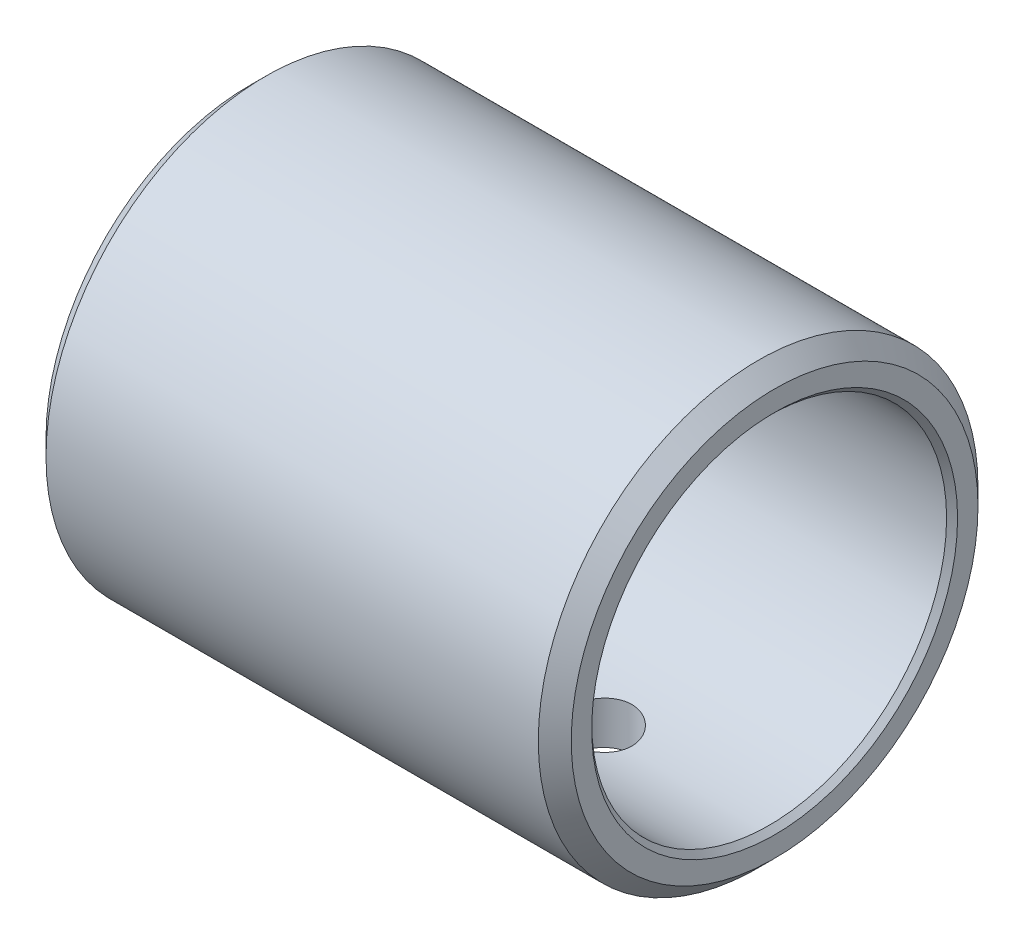
ISO-10303-21;
HEADER;
FILE_DESCRIPTION(('STEP AP214'),'2;1');
FILE_NAME('part.step','',(''),(''),'','','');
FILE_SCHEMA(('AUTOMOTIVE_DESIGN { 1 0 10303 214 1 1 1 1 }'));
ENDSEC;
DATA;
#1=APPLICATION_CONTEXT('core data for automotive mechanical design processes');
#2=APPLICATION_PROTOCOL_DEFINITION('international standard','automotive_design',2000,#1);
#3=PRODUCT_CONTEXT('',#1,'mechanical');
#4=PRODUCT('Part','Part','',(#3));
#5=PRODUCT_RELATED_PRODUCT_CATEGORY('part','',(#4));
#6=PRODUCT_DEFINITION_FORMATION('','',#4);
#7=PRODUCT_DEFINITION_CONTEXT('part definition',#1,'design');
#8=PRODUCT_DEFINITION('design','',#6,#7);
#9=PRODUCT_DEFINITION_SHAPE('','',#8);
#10=(LENGTH_UNIT() NAMED_UNIT(*) SI_UNIT(.MILLI.,.METRE.));
#11=(NAMED_UNIT(*) PLANE_ANGLE_UNIT() SI_UNIT($,.RADIAN.));
#12=(NAMED_UNIT(*) SI_UNIT($,.STERADIAN.) SOLID_ANGLE_UNIT());
#13=UNCERTAINTY_MEASURE_WITH_UNIT(LENGTH_MEASURE(1.E-05),#10,'distance_accuracy_value','');
#14=(GEOMETRIC_REPRESENTATION_CONTEXT(3) GLOBAL_UNCERTAINTY_ASSIGNED_CONTEXT((#13)) GLOBAL_UNIT_ASSIGNED_CONTEXT((#10,
#11,#12)) REPRESENTATION_CONTEXT('',''));
#15=CARTESIAN_POINT('',(0.,0.,0.));
#16=DIRECTION('',(0.,0.,1.));
#17=DIRECTION('',(1.,0.,0.));
#18=AXIS2_PLACEMENT_3D('',#15,#16,#17);
#19=CARTESIAN_POINT('',(0.,0.,0.));
#20=DIRECTION('',(1.,0.,0.));
#21=DIRECTION('',(0.,0.,-1.));
#22=AXIS2_PLACEMENT_3D('',#19,#20,#21);
#23=CYLINDRICAL_SURFACE('',#22,16.15);
#24=CARTESIAN_POINT('',(-32.,-15.8689161570663,3.));
#25=CARTESIAN_POINT('',(-31.833055911466,-15.8689193729994,2.999993567314));
#26=CARTESIAN_POINT('',(-31.6660280287675,-15.8715791864345,2.98601756403366));
#27=CARTESIAN_POINT('',(-31.3366800005733,-15.8819181195118,2.93051932753722));
#28=CARTESIAN_POINT('',(-31.1743640031104,-15.8896015295356,2.888973548015));
#29=CARTESIAN_POINT('',(-30.8592528693755,-15.9090881071179,2.77965392521639));
#30=CARTESIAN_POINT('',(-30.7064490953678,-15.9208874708563,2.71190429235496));
#31=CARTESIAN_POINT('',(-30.4143868407297,-15.947271963233,2.55216393403344));
#32=CARTESIAN_POINT('',(-30.2751272636239,-15.9618568660831,2.46017517310069));
#33=CARTESIAN_POINT('',(-30.0123941606419,-15.992368121215,2.25336978727812));
#34=CARTESIAN_POINT('',(-29.8891101340513,-16.0083074105874,2.13831428834086));
#35=CARTESIAN_POINT('',(-29.6634783242765,-16.0396171623269,1.88915769533491));
#36=CARTESIAN_POINT('',(-29.5611319034402,-16.0549875876264,1.75505536290637));
#37=CARTESIAN_POINT('',(-29.3795556703729,-16.0835662281653,1.47036852943682));
#38=CARTESIAN_POINT('',(-29.3005043288949,-16.0967574263777,1.31966834341584));
#39=CARTESIAN_POINT('',(-29.168911825009,-16.1193465852659,1.00684026870927));
#40=CARTESIAN_POINT('',(-29.1163685233966,-16.1287448520198,0.844713303371084));
#41=CARTESIAN_POINT('',(-29.0398690408333,-16.1425978451571,0.515597086479356));
#42=CARTESIAN_POINT('',(-29.0155934922404,-16.1471077588197,0.348684429713024));
#43=CARTESIAN_POINT('',(-28.9953236835823,-16.1508660642563,0.0130985520982486));
#44=CARTESIAN_POINT('',(-28.9993270579361,-16.1501148961291,-0.155574520309737));
#45=CARTESIAN_POINT('',(-29.0352561584595,-16.1434788505418,-0.487703606743755));
#46=CARTESIAN_POINT('',(-29.0668380205196,-16.1376571970611,-0.65119826492536));
#47=CARTESIAN_POINT('',(-29.1564839635609,-16.1216051767725,-0.970526465303907));
#48=CARTESIAN_POINT('',(-29.2145489964197,-16.1113746514984,-1.12635973190644));
#49=CARTESIAN_POINT('',(-29.3558418996491,-16.0875485465892,-1.42694123908433));
#50=CARTESIAN_POINT('',(-29.4392075995516,-16.0739346107582,-1.57162317635299));
#51=CARTESIAN_POINT('',(-29.6286338856602,-16.0448478634781,-1.84507294507443));
#52=CARTESIAN_POINT('',(-29.7346967387482,-16.0293748664228,-1.97383918491625));
#53=CARTESIAN_POINT('',(-29.9684025705504,-15.9980095645836,-2.21383924438647));
#54=CARTESIAN_POINT('',(-30.0963463617426,-15.9821144540301,-2.32477997107465));
#55=CARTESIAN_POINT('',(-30.3691791490902,-15.9519192707101,-2.52367236811839));
#56=CARTESIAN_POINT('',(-30.5140683841777,-15.9376192204395,-2.61162371426514));
#57=CARTESIAN_POINT('',(-30.8170634992078,-15.9122293988577,-2.76212200352159));
#58=CARTESIAN_POINT('',(-30.9751906900966,-15.9011449373441,-2.82462699575142));
#59=CARTESIAN_POINT('',(-31.2999543502868,-15.8835231384605,-2.92210036596655));
#60=CARTESIAN_POINT('',(-31.4665898724321,-15.8769852961358,-2.95707180192902));
#61=CARTESIAN_POINT('',(-31.8009988747331,-15.8692966897446,-2.99805875968717));
#62=CARTESIAN_POINT('',(-31.968719032866,-15.8680676457401,-3.004495078707));
#63=CARTESIAN_POINT('',(-32.3028377426992,-15.8709264020366,-2.98935651420699));
#64=CARTESIAN_POINT('',(-32.4692363580905,-15.8750139445235,-2.96778298895167));
#65=CARTESIAN_POINT('',(-32.7946092521575,-15.887972445088,-2.89759815956096));
#66=CARTESIAN_POINT('',(-32.9536326834774,-15.8968044580662,-2.84920688861947));
#67=CARTESIAN_POINT('',(-33.2613142312501,-15.9182232783009,-2.7269934454509));
#68=CARTESIAN_POINT('',(-33.4099715951547,-15.9308103578156,-2.65316942918248));
#69=CARTESIAN_POINT('',(-33.6945566470157,-15.9584996441987,-2.48121543361636));
#70=CARTESIAN_POINT('',(-33.8303208464398,-15.9736287563672,-2.38281929379153));
#71=CARTESIAN_POINT('',(-34.083563303703,-16.0046214951236,-2.16487362241044));
#72=CARTESIAN_POINT('',(-34.2010399474514,-16.0204851863864,-2.04532222564283));
#73=CARTESIAN_POINT('',(-34.4159415290735,-16.0514108487518,-1.78658157285044));
#74=CARTESIAN_POINT('',(-34.5130836696507,-16.0664595970687,-1.64715560578479));
#75=CARTESIAN_POINT('',(-34.6825641956172,-16.0938382366002,-1.3537181437136));
#76=CARTESIAN_POINT('',(-34.7549035234813,-16.1061682311176,-1.19970720320209));
#77=CARTESIAN_POINT('',(-34.8723001567152,-16.1266631892054,-0.882258104884032));
#78=CARTESIAN_POINT('',(-34.9174971379771,-16.1348494418412,-0.718873035562327));
#79=CARTESIAN_POINT('',(-34.9797722400186,-16.1462252943236,-0.386664790432342));
#80=CARTESIAN_POINT('',(-34.9968532623493,-16.1494154097671,-0.217842177609057));
#81=CARTESIAN_POINT('',(-35.0023120934064,-16.1504295564388,0.117735358466012));
#82=CARTESIAN_POINT('',(-34.991117295838,-16.1483334899153,0.284483238651951));
#83=CARTESIAN_POINT('',(-34.9412773063603,-16.1391765676468,0.613678374769462));
#84=CARTESIAN_POINT('',(-34.9026323672045,-16.1321157576157,0.776125670285382));
#85=CARTESIAN_POINT('',(-34.7991678089032,-16.1138223614171,1.09188793196435));
#86=CARTESIAN_POINT('',(-34.7343928870845,-16.1025969018202,1.2452179825388));
#87=CARTESIAN_POINT('',(-34.5805579732103,-16.077190273658,1.5388972006634));
#88=CARTESIAN_POINT('',(-34.4914963945485,-16.0630089120029,1.67924551933638));
#89=CARTESIAN_POINT('',(-34.2901412596809,-16.0330041964016,1.945109149938));
#90=CARTESIAN_POINT('',(-34.1775385448706,-16.0171605520886,2.07038805377009));
#91=CARTESIAN_POINT('',(-33.9329397795944,-15.9857460670326,2.30042056076987));
#92=CARTESIAN_POINT('',(-33.800939177115,-15.970175291285,2.40516933272401));
#93=CARTESIAN_POINT('',(-33.5198625986232,-15.9409156214583,2.59205769584853));
#94=CARTESIAN_POINT('',(-33.3706428430066,-15.9272450423357,2.6739839968735));
#95=CARTESIAN_POINT('',(-33.0603530165399,-15.9035535763789,2.81147489113242));
#96=CARTESIAN_POINT('',(-32.8992943578865,-15.8935292287837,2.86706449665303));
#97=CARTESIAN_POINT('',(-32.6147885245896,-15.8803672127894,2.93893758013447));
#98=CARTESIAN_POINT('',(-32.4930123983934,-15.8760984227512,2.96179696728543));
#99=CARTESIAN_POINT('',(-32.2475061678675,-15.8703717397114,2.99233036197711));
#100=CARTESIAN_POINT('',(-32.123776115071,-15.8689137727009,3.00000476933858));
#101=CARTESIAN_POINT('',(-32.,-15.8689161570663,3.));
#102=B_SPLINE_CURVE_WITH_KNOTS('',3,(#24,#25,#26,#27,#28,#29,#30,#31,#32,#33,#34,#35,#36,#37,
#38,#39,#40,#41,#42,#43,#44,#45,#46,#47,#48,#49,#50,#51,#52,#53,#54,#55,#56,#57,#58,#59,#60,#61,
#62,#63,#64,#65,#66,#67,#68,#69,#70,#71,#72,#73,#74,#75,#76,#77,#78,#79,#80,#81,#82,#83,#84,#85,
#86,#87,#88,#89,#90,#91,#92,#93,#94,#95,#96,#97,#98,#99,#100,#101),.UNSPECIFIED.,.T.,.F.,(4,2,2,
2,2,2,2,2,2,2,2,2,2,2,2,2,2,2,2,2,2,2,2,2,2,2,2,2,2,2,2,2,2,2,2,2,2,2,4),(0.,0.500379335116742,
1.00118657631228,1.50153220987653,2.00183730400786,2.5076192634908,3.01343412224963,
3.52302903244936,4.03258281164957,4.53632204067477,5.04001913153862,5.53752410046871,
6.03504695249739,6.53533033258416,7.03566370189626,7.54352858742439,8.05140063475421,
8.56010660242777,9.06875606338827,9.56987915485922,10.0709779465773,10.5680249419595,
11.0651079841066,11.5678284827799,12.0705933272912,12.5799435170616,13.0892743500373,
13.5959611659611,14.1025956888131,14.6016183160098,15.1006363483991,15.5988043677793,
16.097004939437,16.6022131679249,17.1075401411928,17.6174423418003,18.1268593063733,
18.4978616073285,18.8688541396574),.UNSPECIFIED.);
#103=CARTESIAN_POINT('',(-32.,-15.8689161570663,3.));
#104=VERTEX_POINT('',#103);
#105=EDGE_CURVE('E85',#104,#104,#102,.T.);
#106=ORIENTED_EDGE('',*,*,#105,.F.);
#107=EDGE_LOOP('',(#106));
#108=FACE_BOUND('',#107,.T.);
#109=CARTESIAN_POINT('',(-16.,-15.8689161570663,3.));
#110=CARTESIAN_POINT('',(-15.833055911466,-15.8689193729994,2.999993567314));
#111=CARTESIAN_POINT('',(-15.6660280287675,-15.8715791864345,2.98601756403365));
#112=CARTESIAN_POINT('',(-15.3366800005733,-15.8819181195118,2.93051932753722));
#113=CARTESIAN_POINT('',(-15.1743640031104,-15.8896015295356,2.888973548015));
#114=CARTESIAN_POINT('',(-14.8592528693755,-15.9090881071179,2.77965392521639));
#115=CARTESIAN_POINT('',(-14.7064490953678,-15.9208874708563,2.71190429235496));
#116=CARTESIAN_POINT('',(-14.4143868407297,-15.947271963233,2.55216393403343));
#117=CARTESIAN_POINT('',(-14.2751272636239,-15.9618568660831,2.46017517310068));
#118=CARTESIAN_POINT('',(-14.0123941606419,-15.992368121215,2.25336978727812));
#119=CARTESIAN_POINT('',(-13.8891101340513,-16.0083074105874,2.13831428834086));
#120=CARTESIAN_POINT('',(-13.6634783242765,-16.0396171623269,1.88915769533491));
#121=CARTESIAN_POINT('',(-13.5611319034402,-16.0549875876264,1.75505536290637));
#122=CARTESIAN_POINT('',(-13.3795556703729,-16.0835662281653,1.47036852943682));
#123=CARTESIAN_POINT('',(-13.3005043288949,-16.0967574263777,1.31966834341583));
#124=CARTESIAN_POINT('',(-13.168911825009,-16.1193465852659,1.00684026870927));
#125=CARTESIAN_POINT('',(-13.1163685233966,-16.1287448520198,0.844713303371081));
#126=CARTESIAN_POINT('',(-13.0398690408333,-16.1425978451571,0.515597086479354));
#127=CARTESIAN_POINT('',(-13.0155934922404,-16.1471077588197,0.348684429713022));
#128=CARTESIAN_POINT('',(-12.9953236835823,-16.1508660642563,0.0130985520982466));
#129=CARTESIAN_POINT('',(-12.9993270579361,-16.1501148961291,-0.155574520309739));
#130=CARTESIAN_POINT('',(-13.0352561584595,-16.1434788505418,-0.487703606743757));
#131=CARTESIAN_POINT('',(-13.0668380205196,-16.1376571970611,-0.651198264925362));
#132=CARTESIAN_POINT('',(-13.1564839635609,-16.1216051767725,-0.970526465303909));
#133=CARTESIAN_POINT('',(-13.2145489964197,-16.1113746514984,-1.12635973190644));
#134=CARTESIAN_POINT('',(-13.3558418996491,-16.0875485465892,-1.42694123908433));
#135=CARTESIAN_POINT('',(-13.4392075995516,-16.0739346107582,-1.57162317635299));
#136=CARTESIAN_POINT('',(-13.6286338856602,-16.0448478634781,-1.84507294507443));
#137=CARTESIAN_POINT('',(-13.7346967387482,-16.0293748664228,-1.97383918491625));
#138=CARTESIAN_POINT('',(-13.9684025705504,-15.9980095645836,-2.21383924438647));
#139=CARTESIAN_POINT('',(-14.0963463617426,-15.9821144540301,-2.32477997107465));
#140=CARTESIAN_POINT('',(-14.3691791490902,-15.9519192707101,-2.52367236811838));
#141=CARTESIAN_POINT('',(-14.5140683841777,-15.9376192204395,-2.61162371426514));
#142=CARTESIAN_POINT('',(-14.8170634992078,-15.9122293988577,-2.76212200352159));
#143=CARTESIAN_POINT('',(-14.9751906900966,-15.9011449373441,-2.82462699575141));
#144=CARTESIAN_POINT('',(-15.2999543502868,-15.8835231384605,-2.92210036596655));
#145=CARTESIAN_POINT('',(-15.4665898724321,-15.8769852961358,-2.95707180192902));
#146=CARTESIAN_POINT('',(-15.8009988747331,-15.8692966897446,-2.99805875968717));
#147=CARTESIAN_POINT('',(-15.968719032866,-15.8680676457401,-3.004495078707));
#148=CARTESIAN_POINT('',(-16.3028377426992,-15.8709264020366,-2.98935651420699));
#149=CARTESIAN_POINT('',(-16.4692363580905,-15.8750139445235,-2.96778298895166));
#150=CARTESIAN_POINT('',(-16.7946092521575,-15.887972445088,-2.89759815956096));
#151=CARTESIAN_POINT('',(-16.9536326834774,-15.8968044580662,-2.84920688861946));
#152=CARTESIAN_POINT('',(-17.2613142312501,-15.9182232783009,-2.7269934454509));
#153=CARTESIAN_POINT('',(-17.4099715951547,-15.9308103578156,-2.65316942918248));
#154=CARTESIAN_POINT('',(-17.6945566470157,-15.9584996441987,-2.48121543361636));
#155=CARTESIAN_POINT('',(-17.8303208464398,-15.9736287563672,-2.38281929379153));
#156=CARTESIAN_POINT('',(-18.083563303703,-16.0046214951236,-2.16487362241043));
#157=CARTESIAN_POINT('',(-18.2010399474514,-16.0204851863864,-2.04532222564283));
#158=CARTESIAN_POINT('',(-18.4159415290735,-16.0514108487518,-1.78658157285044));
#159=CARTESIAN_POINT('',(-18.5130836696507,-16.0664595970687,-1.64715560578479));
#160=CARTESIAN_POINT('',(-18.6825641956172,-16.0938382366002,-1.3537181437136));
#161=CARTESIAN_POINT('',(-18.7549035234813,-16.1061682311176,-1.19970720320209));
#162=CARTESIAN_POINT('',(-18.8723001567152,-16.1266631892054,-0.882258104884031));
#163=CARTESIAN_POINT('',(-18.917497137977,-16.1348494418412,-0.718873035562326));
#164=CARTESIAN_POINT('',(-18.9797722400185,-16.1462252943236,-0.386664790432342));
#165=CARTESIAN_POINT('',(-18.9968532623493,-16.1494154097671,-0.217842177609057));
#166=CARTESIAN_POINT('',(-19.0023120934064,-16.1504295564388,0.117735358466011));
#167=CARTESIAN_POINT('',(-18.991117295838,-16.1483334899153,0.28448323865195));
#168=CARTESIAN_POINT('',(-18.9412773063603,-16.1391765676468,0.613678374769462));
#169=CARTESIAN_POINT('',(-18.9026323672045,-16.1321157576157,0.776125670285383));
#170=CARTESIAN_POINT('',(-18.7991678089032,-16.1138223614171,1.09188793196435));
#171=CARTESIAN_POINT('',(-18.7343928870845,-16.1025969018202,1.2452179825388));
#172=CARTESIAN_POINT('',(-18.5805579732103,-16.077190273658,1.5388972006634));
#173=CARTESIAN_POINT('',(-18.4914963945485,-16.0630089120029,1.67924551933638));
#174=CARTESIAN_POINT('',(-18.2901412596809,-16.0330041964016,1.945109149938));
#175=CARTESIAN_POINT('',(-18.1775385448706,-16.0171605520886,2.07038805377009));
#176=CARTESIAN_POINT('',(-17.9329397795944,-15.9857460670326,2.30042056076987));
#177=CARTESIAN_POINT('',(-17.800939177115,-15.970175291285,2.40516933272401));
#178=CARTESIAN_POINT('',(-17.5198625986232,-15.9409156214583,2.59205769584853));
#179=CARTESIAN_POINT('',(-17.3706428430066,-15.9272450423357,2.6739839968735));
#180=CARTESIAN_POINT('',(-17.0603530165399,-15.9035535763789,2.81147489113242));
#181=CARTESIAN_POINT('',(-16.8992943578865,-15.8935292287837,2.86706449665302));
#182=CARTESIAN_POINT('',(-16.6147885245896,-15.8803672127894,2.93893758013447));
#183=CARTESIAN_POINT('',(-16.4930123983934,-15.8760984227512,2.96179696728543));
#184=CARTESIAN_POINT('',(-16.2475061678675,-15.8703717397114,2.99233036197711));
#185=CARTESIAN_POINT('',(-16.123776115071,-15.8689137727009,3.00000476933858));
#186=CARTESIAN_POINT('',(-16.,-15.8689161570663,3.));
#187=B_SPLINE_CURVE_WITH_KNOTS('',3,(#109,#110,#111,#112,#113,#114,#115,#116,#117,#118,#119,
#120,#121,#122,#123,#124,#125,#126,#127,#128,#129,#130,#131,#132,#133,#134,#135,#136,#137,#138,
#139,#140,#141,#142,#143,#144,#145,#146,#147,#148,#149,#150,#151,#152,#153,#154,#155,#156,#157,
#158,#159,#160,#161,#162,#163,#164,#165,#166,#167,#168,#169,#170,#171,#172,#173,#174,#175,#176,
#177,#178,#179,#180,#181,#182,#183,#184,#185,#186),.UNSPECIFIED.,.T.,.F.,(4,2,2,2,2,2,2,2,2,2,2,
2,2,2,2,2,2,2,2,2,2,2,2,2,2,2,2,2,2,2,2,2,2,2,2,2,2,2,4),(0.,0.500379335116739,1.00118657631228,
1.50153220987653,2.00183730400786,2.5076192634908,3.01343412224963,3.52302903244936,
4.03258281164957,4.53632204067477,5.04001913153862,5.5375241004687,6.03504695249739,
6.53533033258415,7.03566370189626,7.54352858742439,8.0514006347542,8.56010660242777,
9.06875606338826,9.56987915485921,10.0709779465773,10.5680249419595,11.0651079841066,
11.5678284827799,12.0705933272912,12.5799435170616,13.0892743500373,13.5959611659611,
14.1025956888131,14.6016183160098,15.1006363483991,15.5988043677792,16.097004939437,
16.6022131679249,17.1075401411928,17.6174423418002,18.1268593063732,18.4978616073285,
18.8688541396574),.UNSPECIFIED.);
#188=CARTESIAN_POINT('',(-16.,-15.8689161570663,3.));
#189=VERTEX_POINT('',#188);
#190=EDGE_CURVE('E76',#189,#189,#187,.T.);
#191=ORIENTED_EDGE('',*,*,#190,.F.);
#192=EDGE_LOOP('',(#191));
#193=FACE_BOUND('',#192,.T.);
#194=CARTESIAN_POINT('',(-0.500000000000004,0.,0.));
#195=DIRECTION('',(1.,0.,0.));
#196=DIRECTION('',(0.,0.,-1.));
#197=AXIS2_PLACEMENT_3D('',#194,#195,#196);
#198=CIRCLE('',#197,16.15);
#199=CARTESIAN_POINT('',(-0.500000000000004,0.,-16.15));
#200=VERTEX_POINT('',#199);
#201=EDGE_CURVE('E116',#200,#200,#198,.T.);
#202=ORIENTED_EDGE('',*,*,#201,.T.);
#203=EDGE_LOOP('',(#202));
#204=FACE_BOUND('',#203,.T.);
#205=CARTESIAN_POINT('',(-47.3,0.,0.));
#206=DIRECTION('',(-1.,0.,0.));
#207=DIRECTION('',(0.,0.,1.));
#208=AXIS2_PLACEMENT_3D('',#205,#206,#207);
#209=CIRCLE('',#208,16.15);
#210=CARTESIAN_POINT('',(-47.3,0.,16.15));
#211=VERTEX_POINT('',#210);
#212=EDGE_CURVE('E118',#211,#211,#209,.T.);
#213=ORIENTED_EDGE('',*,*,#212,.T.);
#214=EDGE_LOOP('',(#213));
#215=FACE_BOUND('',#214,.T.);
#216=ADVANCED_FACE('F36',(#108,#193,#204,#215),#23,.F.);
#217=CARTESIAN_POINT('',(0.,16.15,0.));
#218=DIRECTION('',(1.,0.,0.));
#219=DIRECTION('',(0.,0.,-1.));
#220=AXIS2_PLACEMENT_3D('',#217,#218,#219);
#221=PLANE('',#220);
#222=CARTESIAN_POINT('',(0.,0.,0.));
#223=DIRECTION('',(1.,0.,0.));
#224=DIRECTION('',(0.,0.,-1.));
#225=AXIS2_PLACEMENT_3D('',#222,#223,#224);
#226=CIRCLE('',#225,16.65);
#227=CARTESIAN_POINT('',(0.,0.,-16.65));
#228=VERTEX_POINT('',#227);
#229=EDGE_CURVE('E56',#228,#228,#226,.F.);
#230=ORIENTED_EDGE('',*,*,#229,.T.);
#231=EDGE_LOOP('',(#230));
#232=FACE_BOUND('',#231,.T.);
#233=CARTESIAN_POINT('',(0.,0.,0.));
#234=DIRECTION('',(1.,0.,0.));
#235=DIRECTION('',(0.,0.,-1.));
#236=AXIS2_PLACEMENT_3D('',#233,#234,#235);
#237=CIRCLE('',#236,18.5075);
#238=CARTESIAN_POINT('',(0.,0.,-18.5075));
#239=VERTEX_POINT('',#238);
#240=EDGE_CURVE('E84',#239,#239,#237,.T.);
#241=ORIENTED_EDGE('',*,*,#240,.T.);
#242=EDGE_LOOP('',(#241));
#243=FACE_BOUND('',#242,.T.);
#244=ADVANCED_FACE('F93',(#232,#243),#221,.T.);
#245=CARTESIAN_POINT('',(0.,0.,0.));
#246=DIRECTION('',(1.,0.,0.));
#247=DIRECTION('',(0.,0.,-1.));
#248=AXIS2_PLACEMENT_3D('',#245,#246,#247);
#249=CYLINDRICAL_SURFACE('',#248,20.0075);
#250=CARTESIAN_POINT('',(-29.,-20.0075,0.));
#251=CARTESIAN_POINT('',(-29.0000069082289,-20.0074973161092,0.16750383823174));
#252=CARTESIAN_POINT('',(-29.0140761274921,-20.0053744283827,0.335104887546084));
#253=CARTESIAN_POINT('',(-29.0699670523987,-19.9971101214476,0.665622339343429));
#254=CARTESIAN_POINT('',(-29.1118157848016,-19.9909647888734,0.828534018321167));
#255=CARTESIAN_POINT('',(-29.2219872099311,-19.9753461927211,1.14484164946772));
#256=CARTESIAN_POINT('',(-29.2902898986742,-19.9658754442641,1.29824469045284));
#257=CARTESIAN_POINT('',(-29.4513815090377,-19.9446525474565,1.59138857593256));
#258=CARTESIAN_POINT('',(-29.5441670279305,-19.9329007162004,1.73113131529775));
#259=CARTESIAN_POINT('',(-29.7523622459022,-19.9083199198583,1.99410216248882));
#260=CARTESIAN_POINT('',(-29.8679253470925,-19.8954840086804,2.11720818477266));
#261=CARTESIAN_POINT('',(-30.1180652246234,-19.8702361120101,2.34235774812581));
#262=CARTESIAN_POINT('',(-30.252643093572,-19.8578241509292,2.44440007802386));
#263=CARTESIAN_POINT('',(-30.5378125256811,-19.8347620583366,2.62500082591923));
#264=CARTESIAN_POINT('',(-30.6884796775963,-19.8241209030458,2.70344113458974));
#265=CARTESIAN_POINT('',(-31.0010364273005,-19.8059000515955,2.8338564166447));
#266=CARTESIAN_POINT('',(-31.1629254133553,-19.7983201887096,2.88583283136434));
#267=CARTESIAN_POINT('',(-31.4920465117453,-19.7871484047947,2.96146578329569));
#268=CARTESIAN_POINT('',(-31.6592295788646,-19.7835270676401,2.98533131913844));
#269=CARTESIAN_POINT('',(-31.9952637241776,-19.7805930407103,3.00471251398295));
#270=CARTESIAN_POINT('',(-32.1641147061147,-19.7812801037282,3.00022979954735));
#271=CARTESIAN_POINT('',(-32.4972152662516,-19.7868583496106,2.96321254178874));
#272=CARTESIAN_POINT('',(-32.6614913802395,-19.7917146464751,2.93091076698297));
#273=CARTESIAN_POINT('',(-32.9822653367216,-19.8050296791536,2.83953669015456));
#274=CARTESIAN_POINT('',(-33.1387629591884,-19.8134885168066,2.78046363133993));
#275=CARTESIAN_POINT('',(-33.4402457860024,-19.8330940665507,2.63698173823855));
#276=CARTESIAN_POINT('',(-33.5851833583623,-19.8442512053957,2.55247430315373));
#277=CARTESIAN_POINT('',(-33.8589090139481,-19.8679886871676,2.36059273602862));
#278=CARTESIAN_POINT('',(-33.9876960371497,-19.8805691234081,2.25321710430502));
#279=CARTESIAN_POINT('',(-34.2268138424541,-19.9058898358076,2.01736941500614));
#280=CARTESIAN_POINT('',(-34.3369472939388,-19.9186304528039,1.88869723029319));
#281=CARTESIAN_POINT('',(-34.5340865878387,-19.9427191993083,1.61459107108596));
#282=CARTESIAN_POINT('',(-34.621092329115,-19.9540673227268,1.46915702329504));
#283=CARTESIAN_POINT('',(-34.7695165591843,-19.9741043002593,1.16548447420461));
#284=CARTESIAN_POINT('',(-34.8309198291521,-19.9827915718765,1.00723842363585));
#285=CARTESIAN_POINT('',(-34.9262245788591,-19.9965147845561,0.682521401283538));
#286=CARTESIAN_POINT('',(-34.9601279164406,-20.0015509722763,0.516050985928431));
#287=CARTESIAN_POINT('',(-34.9992080280906,-20.0073719069411,0.181313832849796));
#288=CARTESIAN_POINT('',(-35.0046560937642,-20.0081968024905,0.0130794404965999));
#289=CARTESIAN_POINT('',(-34.9873910942755,-20.0056114954421,-0.321900580312455));
#290=CARTESIAN_POINT('',(-34.9646789002388,-20.0022014238513,-0.488646254660457));
#291=CARTESIAN_POINT('',(-34.8919636851731,-19.9915541786449,-0.815093846154517));
#292=CARTESIAN_POINT('',(-34.8420928285441,-19.9843355442085,-0.974825859070546));
#293=CARTESIAN_POINT('',(-34.7166153083273,-19.9668779687518,-1.2836612118251));
#294=CARTESIAN_POINT('',(-34.6410074369168,-19.9566388859866,-1.43276405244574));
#295=CARTESIAN_POINT('',(-34.4655656013466,-19.9341785183665,-1.71730154598058));
#296=CARTESIAN_POINT('',(-34.3655595393616,-19.9219433664278,-1.85262897103999));
#297=CARTESIAN_POINT('',(-34.1443997440255,-19.8968958651856,-2.1046765848336));
#298=CARTESIAN_POINT('',(-34.0232447825882,-19.8840834823951,-2.22139569225597));
#299=CARTESIAN_POINT('',(-33.7620186330541,-19.859198258543,-2.43390051369781));
#300=CARTESIAN_POINT('',(-33.6217987394117,-19.8471324409832,-2.52950437587333));
#301=CARTESIAN_POINT('',(-33.3271307843849,-19.8252308660429,-2.69580084619913));
#302=CARTESIAN_POINT('',(-33.1726831073383,-19.8153950484477,-2.76649412701509));
#303=CARTESIAN_POINT('',(-32.8544861603043,-19.7991179454348,-2.88068084230387));
#304=CARTESIAN_POINT('',(-32.6907718752529,-19.7926647276752,-2.92426999115971));
#305=CARTESIAN_POINT('',(-32.3582423788453,-19.7838517432042,-2.98331573359227));
#306=CARTESIAN_POINT('',(-32.1894275202802,-19.7814916940372,-2.99877426836981));
#307=CARTESIAN_POINT('',(-31.8533014908001,-19.7811427986581,-3.0010738180887));
#308=CARTESIAN_POINT('',(-31.6859922512247,-19.7831102769886,-2.98820076801941));
#309=CARTESIAN_POINT('',(-31.3559468238949,-19.7910998324858,-2.93481529343325));
#310=CARTESIAN_POINT('',(-31.193210628833,-19.7971219031731,-2.89430291308547));
#311=CARTESIAN_POINT('',(-30.8770099155808,-19.8125268427019,-2.78688985468517));
#312=CARTESIAN_POINT('',(-30.7235384818889,-19.8219071676653,-2.72000914677189));
#313=CARTESIAN_POINT('',(-30.4299485898224,-19.8429747921664,-2.56178639540041));
#314=CARTESIAN_POINT('',(-30.2898305831195,-19.8546621696976,-2.47044352492211));
#315=CARTESIAN_POINT('',(-30.0254722437525,-19.8791674480726,-2.26485047996245));
#316=CARTESIAN_POINT('',(-29.9013974948096,-19.8919951367733,-2.1503885347054));
#317=CARTESIAN_POINT('',(-29.6741151253982,-19.9172539588679,-1.90225398916007));
#318=CARTESIAN_POINT('',(-29.5709123621371,-19.9296849993906,-1.76857692959541));
#319=CARTESIAN_POINT('',(-29.3877965606873,-19.9528279630887,-1.48494196829));
#320=CARTESIAN_POINT('',(-29.3080147282599,-19.9635300558101,-1.3348985714756));
#321=CARTESIAN_POINT('',(-29.1749040984005,-19.9819128606579,-1.02345157629675));
#322=CARTESIAN_POINT('',(-29.1215479007902,-19.9895967006283,-0.862059943867553));
#323=CARTESIAN_POINT('',(-29.0549088668629,-19.9993231026166,-0.583286996350509));
#324=CARTESIAN_POINT('',(-29.0343495075329,-20.0023736922955,-0.467626455874224));
#325=CARTESIAN_POINT('',(-29.006892738923,-20.0064630686736,-0.234659835170022));
#326=CARTESIAN_POINT('',(-28.9999951600706,-20.0075018803433,-0.117353775384796));
#327=CARTESIAN_POINT('',(-29.,-20.0075,0.));
#328=B_SPLINE_CURVE_WITH_KNOTS('',3,(#250,#251,#252,#253,#254,#255,#256,#257,#258,#259,#260,
#261,#262,#263,#264,#265,#266,#267,#268,#269,#270,#271,#272,#273,#274,#275,#276,#277,#278,#279,
#280,#281,#282,#283,#284,#285,#286,#287,#288,#289,#290,#291,#292,#293,#294,#295,#296,#297,#298,
#299,#300,#301,#302,#303,#304,#305,#306,#307,#308,#309,#310,#311,#312,#313,#314,#315,#316,#317,
#318,#319,#320,#321,#322,#323,#324,#325,#326,#327),.UNSPECIFIED.,.T.,.F.,(4,2,2,2,2,2,2,2,2,2,2,
2,2,2,2,2,2,2,2,2,2,2,2,2,2,2,2,2,2,2,2,2,2,2,2,2,2,2,4),(0.,0.502082691379677,1.00465457763555,
1.50684716815963,2.00896999855958,2.51459778477286,3.02025463670514,3.52840135225073,
4.0365203890235,4.54083732929833,5.04512533319663,5.54523438912001,6.04535758340708,
6.54744512730167,7.04956560795628,7.5567046553532,8.06384592046279,8.57128821623285,
9.07869622732559,9.5812576788584,10.0838035842551,10.5839254837619,11.0840708569243,
11.5878516430578,12.0916616927571,12.5996547734505,13.1076341356481,13.6138092989007,
14.1199495313512,14.621005016568,15.1220597010738,15.6227356368876,16.1234285017582,
16.6289346179417,17.134558237553,17.6429625881308,18.1508386756249,18.5026039328663,
18.8543648239047),.UNSPECIFIED.);
#329=CARTESIAN_POINT('',(-29.,-20.0075,0.));
#330=VERTEX_POINT('',#329);
#331=EDGE_CURVE('E10',#330,#330,#328,.T.);
#332=ORIENTED_EDGE('',*,*,#331,.F.);
#333=EDGE_LOOP('',(#332));
#334=FACE_BOUND('',#333,.T.);
#335=CARTESIAN_POINT('',(-13.,-20.0075,0.));
#336=CARTESIAN_POINT('',(-13.0000069082289,-20.0074973161092,0.16750383823174));
#337=CARTESIAN_POINT('',(-13.0140761274921,-20.0053744283827,0.335104887546084));
#338=CARTESIAN_POINT('',(-13.0699670523987,-19.9971101214476,0.665622339343428));
#339=CARTESIAN_POINT('',(-13.1118157848016,-19.9909647888734,0.828534018321167));
#340=CARTESIAN_POINT('',(-13.2219872099311,-19.9753461927211,1.14484164946772));
#341=CARTESIAN_POINT('',(-13.2902898986743,-19.9658754442641,1.29824469045284));
#342=CARTESIAN_POINT('',(-13.4513815090377,-19.9446525474565,1.59138857593255));
#343=CARTESIAN_POINT('',(-13.5441670279305,-19.9329007162004,1.73113131529775));
#344=CARTESIAN_POINT('',(-13.7523622459022,-19.9083199198583,1.99410216248882));
#345=CARTESIAN_POINT('',(-13.8679253470925,-19.8954840086804,2.11720818477266));
#346=CARTESIAN_POINT('',(-14.1180652246234,-19.8702361120101,2.34235774812581));
#347=CARTESIAN_POINT('',(-14.252643093572,-19.8578241509292,2.44440007802385));
#348=CARTESIAN_POINT('',(-14.5378125256811,-19.8347620583366,2.62500082591923));
#349=CARTESIAN_POINT('',(-14.6884796775963,-19.8241209030458,2.70344113458974));
#350=CARTESIAN_POINT('',(-15.0010364273005,-19.8059000515955,2.8338564166447));
#351=CARTESIAN_POINT('',(-15.1629254133553,-19.7983201887096,2.88583283136434));
#352=CARTESIAN_POINT('',(-15.4920465117453,-19.7871484047947,2.96146578329569));
#353=CARTESIAN_POINT('',(-15.6592295788647,-19.7835270676401,2.98533131913844));
#354=CARTESIAN_POINT('',(-15.9952637241776,-19.7805930407103,3.00471251398295));
#355=CARTESIAN_POINT('',(-16.1641147061147,-19.7812801037282,3.00022979954735));
#356=CARTESIAN_POINT('',(-16.4972152662516,-19.7868583496106,2.96321254178874));
#357=CARTESIAN_POINT('',(-16.6614913802395,-19.7917146464751,2.93091076698297));
#358=CARTESIAN_POINT('',(-16.9822653367216,-19.8050296791536,2.83953669015456));
#359=CARTESIAN_POINT('',(-17.1387629591884,-19.8134885168066,2.78046363133992));
#360=CARTESIAN_POINT('',(-17.4402457860024,-19.8330940665507,2.63698173823854));
#361=CARTESIAN_POINT('',(-17.5851833583623,-19.8442512053957,2.55247430315372));
#362=CARTESIAN_POINT('',(-17.8589090139481,-19.8679886871676,2.36059273602862));
#363=CARTESIAN_POINT('',(-17.9876960371497,-19.8805691234081,2.25321710430501));
#364=CARTESIAN_POINT('',(-18.2268138424541,-19.9058898358076,2.01736941500614));
#365=CARTESIAN_POINT('',(-18.3369472939388,-19.9186304528039,1.88869723029319));
#366=CARTESIAN_POINT('',(-18.5340865878387,-19.9427191993083,1.61459107108595));
#367=CARTESIAN_POINT('',(-18.621092329115,-19.9540673227268,1.46915702329504));
#368=CARTESIAN_POINT('',(-18.7695165591843,-19.9741043002593,1.1654844742046));
#369=CARTESIAN_POINT('',(-18.8309198291521,-19.9827915718765,1.00723842363585));
#370=CARTESIAN_POINT('',(-18.9262245788591,-19.9965147845561,0.682521401283536));
#371=CARTESIAN_POINT('',(-18.9601279164406,-20.0015509722763,0.51605098592843));
#372=CARTESIAN_POINT('',(-18.9992080280906,-20.0073719069411,0.181313832849796));
#373=CARTESIAN_POINT('',(-19.0046560937642,-20.0081968024905,0.0130794404966008));
#374=CARTESIAN_POINT('',(-18.9873910942755,-20.0056114954421,-0.321900580312454));
#375=CARTESIAN_POINT('',(-18.9646789002388,-20.0022014238513,-0.488646254660457));
#376=CARTESIAN_POINT('',(-18.8919636851731,-19.9915541786449,-0.815093846154518));
#377=CARTESIAN_POINT('',(-18.8420928285441,-19.9843355442085,-0.974825859070548));
#378=CARTESIAN_POINT('',(-18.7166153083273,-19.9668779687518,-1.2836612118251));
#379=CARTESIAN_POINT('',(-18.6410074369168,-19.9566388859866,-1.43276405244574));
#380=CARTESIAN_POINT('',(-18.4655656013466,-19.9341785183665,-1.71730154598058));
#381=CARTESIAN_POINT('',(-18.3655595393616,-19.9219433664278,-1.85262897103999));
#382=CARTESIAN_POINT('',(-18.1443997440255,-19.8968958651856,-2.1046765848336));
#383=CARTESIAN_POINT('',(-18.0232447825882,-19.8840834823951,-2.22139569225597));
#384=CARTESIAN_POINT('',(-17.7620186330541,-19.859198258543,-2.43390051369781));
#385=CARTESIAN_POINT('',(-17.6217987394117,-19.8471324409832,-2.52950437587333));
#386=CARTESIAN_POINT('',(-17.3271307843849,-19.8252308660429,-2.69580084619913));
#387=CARTESIAN_POINT('',(-17.1726831073383,-19.8153950484477,-2.76649412701509));
#388=CARTESIAN_POINT('',(-16.8544861603043,-19.7991179454348,-2.88068084230386));
#389=CARTESIAN_POINT('',(-16.6907718752529,-19.7926647276752,-2.92426999115971));
#390=CARTESIAN_POINT('',(-16.3582423788453,-19.7838517432042,-2.98331573359227));
#391=CARTESIAN_POINT('',(-16.1894275202802,-19.7814916940372,-2.99877426836981));
#392=CARTESIAN_POINT('',(-15.8533014908001,-19.7811427986581,-3.0010738180887));
#393=CARTESIAN_POINT('',(-15.6859922512247,-19.7831102769886,-2.98820076801941));
#394=CARTESIAN_POINT('',(-15.3559468238949,-19.7910998324858,-2.93481529343325));
#395=CARTESIAN_POINT('',(-15.193210628833,-19.7971219031731,-2.89430291308547));
#396=CARTESIAN_POINT('',(-14.8770099155808,-19.8125268427019,-2.78688985468517));
#397=CARTESIAN_POINT('',(-14.7235384818889,-19.8219071676653,-2.72000914677189));
#398=CARTESIAN_POINT('',(-14.4299485898224,-19.8429747921664,-2.5617863954004));
#399=CARTESIAN_POINT('',(-14.2898305831195,-19.8546621696976,-2.47044352492211));
#400=CARTESIAN_POINT('',(-14.0254722437525,-19.8791674480726,-2.26485047996245));
#401=CARTESIAN_POINT('',(-13.9013974948096,-19.8919951367733,-2.1503885347054));
#402=CARTESIAN_POINT('',(-13.6741151253982,-19.9172539588679,-1.90225398916007));
#403=CARTESIAN_POINT('',(-13.5709123621371,-19.9296849993906,-1.76857692959541));
#404=CARTESIAN_POINT('',(-13.3877965606873,-19.9528279630887,-1.48494196829));
#405=CARTESIAN_POINT('',(-13.3080147282599,-19.9635300558101,-1.3348985714756));
#406=CARTESIAN_POINT('',(-13.1749040984005,-19.9819128606579,-1.02345157629675));
#407=CARTESIAN_POINT('',(-13.1215479007902,-19.9895967006283,-0.862059943867551));
#408=CARTESIAN_POINT('',(-13.0549088668629,-19.9993231026166,-0.583286996350508));
#409=CARTESIAN_POINT('',(-13.0343495075329,-20.0023736922955,-0.467626455874223));
#410=CARTESIAN_POINT('',(-13.006892738923,-20.0064630686736,-0.234659835170022));
#411=CARTESIAN_POINT('',(-12.9999951600707,-20.0075018803433,-0.117353775384796));
#412=CARTESIAN_POINT('',(-13.,-20.0075,0.));
#413=B_SPLINE_CURVE_WITH_KNOTS('',3,(#335,#336,#337,#338,#339,#340,#341,#342,#343,#344,#345,
#346,#347,#348,#349,#350,#351,#352,#353,#354,#355,#356,#357,#358,#359,#360,#361,#362,#363,#364,
#365,#366,#367,#368,#369,#370,#371,#372,#373,#374,#375,#376,#377,#378,#379,#380,#381,#382,#383,
#384,#385,#386,#387,#388,#389,#390,#391,#392,#393,#394,#395,#396,#397,#398,#399,#400,#401,#402,
#403,#404,#405,#406,#407,#408,#409,#410,#411,#412),.UNSPECIFIED.,.T.,.F.,(4,2,2,2,2,2,2,2,2,2,2,
2,2,2,2,2,2,2,2,2,2,2,2,2,2,2,2,2,2,2,2,2,2,2,2,2,2,2,4),(0.,0.502082691379677,1.00465457763555,
1.50684716815963,2.00896999855958,2.51459778477286,3.02025463670514,3.52840135225073,
4.0365203890235,4.54083732929833,5.04512533319662,5.54523438912001,6.04535758340707,
6.54744512730167,7.04956560795628,7.55670465535321,8.06384592046279,8.57128821623285,
9.07869622732558,9.5812576788584,10.0838035842551,10.5839254837619,11.0840708569243,
11.5878516430578,12.0916616927571,12.5996547734505,13.1076341356481,13.6138092989007,
14.1199495313512,14.621005016568,15.1220597010738,15.6227356368876,16.1234285017582,
16.6289346179417,17.134558237553,17.6429625881308,18.1508386756249,18.5026039328662,
18.8543648239047),.UNSPECIFIED.);
#414=CARTESIAN_POINT('',(-13.,-20.0075,0.));
#415=VERTEX_POINT('',#414);
#416=EDGE_CURVE('E48',#415,#415,#413,.T.);
#417=ORIENTED_EDGE('',*,*,#416,.F.);
#418=EDGE_LOOP('',(#417));
#419=FACE_BOUND('',#418,.T.);
#420=CARTESIAN_POINT('',(-1.50000000000001,0.,0.));
#421=DIRECTION('',(1.,0.,0.));
#422=DIRECTION('',(0.,0.,-1.));
#423=AXIS2_PLACEMENT_3D('',#420,#421,#422);
#424=CIRCLE('',#423,20.0075);
#425=CARTESIAN_POINT('',(-1.50000000000001,0.,-20.0075));
#426=VERTEX_POINT('',#425);
#427=EDGE_CURVE('E126',#426,#426,#424,.F.);
#428=ORIENTED_EDGE('',*,*,#427,.T.);
#429=EDGE_LOOP('',(#428));
#430=FACE_BOUND('',#429,.T.);
#431=CARTESIAN_POINT('',(-46.3,0.,0.));
#432=DIRECTION('',(-1.,0.,0.));
#433=DIRECTION('',(0.,0.,1.));
#434=AXIS2_PLACEMENT_3D('',#431,#432,#433);
#435=CIRCLE('',#434,20.0075);
#436=CARTESIAN_POINT('',(-46.3,0.,20.0075));
#437=VERTEX_POINT('',#436);
#438=EDGE_CURVE('E128',#437,#437,#435,.F.);
#439=ORIENTED_EDGE('',*,*,#438,.T.);
#440=EDGE_LOOP('',(#439));
#441=FACE_BOUND('',#440,.T.);
#442=ADVANCED_FACE('F63',(#334,#419,#430,#441),#249,.T.);
#443=CARTESIAN_POINT('',(-47.8,20.0075,0.));
#444=DIRECTION('',(-1.,0.,0.));
#445=DIRECTION('',(0.,0.,1.));
#446=AXIS2_PLACEMENT_3D('',#443,#444,#445);
#447=PLANE('',#446);
#448=CARTESIAN_POINT('',(-47.8,0.,0.));
#449=DIRECTION('',(-1.,0.,0.));
#450=DIRECTION('',(0.,0.,1.));
#451=AXIS2_PLACEMENT_3D('',#448,#449,#450);
#452=CIRCLE('',#451,16.65);
#453=CARTESIAN_POINT('',(-47.8,0.,16.65));
#454=VERTEX_POINT('',#453);
#455=EDGE_CURVE('E52',#454,#454,#452,.F.);
#456=ORIENTED_EDGE('',*,*,#455,.T.);
#457=EDGE_LOOP('',(#456));
#458=FACE_BOUND('',#457,.T.);
#459=CARTESIAN_POINT('',(-47.8,0.,0.));
#460=DIRECTION('',(-1.,0.,0.));
#461=DIRECTION('',(0.,0.,1.));
#462=AXIS2_PLACEMENT_3D('',#459,#460,#461);
#463=CIRCLE('',#462,18.5075);
#464=CARTESIAN_POINT('',(-47.8,0.,18.5075));
#465=VERTEX_POINT('',#464);
#466=EDGE_CURVE('E121',#465,#465,#463,.T.);
#467=ORIENTED_EDGE('',*,*,#466,.T.);
#468=EDGE_LOOP('',(#467));
#469=FACE_BOUND('',#468,.T.);
#470=ADVANCED_FACE('F73',(#458,#469),#447,.T.);
#471=CARTESIAN_POINT('',(0.,0.,0.));
#472=DIRECTION('',(-1.,0.,0.));
#473=DIRECTION('',(0.,0.,1.));
#474=AXIS2_PLACEMENT_3D('',#471,#472,#473);
#475=CONICAL_SURFACE('',#474,18.5075,0.785398163397444);
#476=ORIENTED_EDGE('',*,*,#427,.F.);
#477=EDGE_LOOP('',(#476));
#478=FACE_BOUND('',#477,.T.);
#479=ORIENTED_EDGE('',*,*,#240,.F.);
#480=EDGE_LOOP('',(#479));
#481=FACE_BOUND('',#480,.T.);
#482=ADVANCED_FACE('F95',(#478,#481),#475,.T.);
#483=CARTESIAN_POINT('',(-46.3,0.,0.));
#484=DIRECTION('',(1.,0.,0.));
#485=DIRECTION('',(0.,0.,-1.));
#486=AXIS2_PLACEMENT_3D('',#483,#484,#485);
#487=CONICAL_SURFACE('',#486,20.0075,0.785398163397452);
#488=ORIENTED_EDGE('',*,*,#466,.F.);
#489=EDGE_LOOP('',(#488));
#490=FACE_BOUND('',#489,.T.);
#491=ORIENTED_EDGE('',*,*,#438,.F.);
#492=EDGE_LOOP('',(#491));
#493=FACE_BOUND('',#492,.T.);
#494=ADVANCED_FACE('F99',(#490,#493),#487,.T.);
#495=CARTESIAN_POINT('',(-0.500000000000004,0.,0.));
#496=DIRECTION('',(1.,0.,0.));
#497=DIRECTION('',(0.,0.,-1.));
#498=AXIS2_PLACEMENT_3D('',#495,#496,#497);
#499=CONICAL_SURFACE('',#498,16.15,0.785398163397448);
#500=ORIENTED_EDGE('',*,*,#229,.F.);
#501=EDGE_LOOP('',(#500));
#502=FACE_BOUND('',#501,.T.);
#503=ORIENTED_EDGE('',*,*,#201,.F.);
#504=EDGE_LOOP('',(#503));
#505=FACE_BOUND('',#504,.T.);
#506=ADVANCED_FACE('F102',(#502,#505),#499,.F.);
#507=CARTESIAN_POINT('',(-47.8,0.,0.));
#508=DIRECTION('',(-1.,0.,0.));
#509=DIRECTION('',(0.,0.,1.));
#510=AXIS2_PLACEMENT_3D('',#507,#508,#509);
#511=CONICAL_SURFACE('',#510,16.65,0.785398163397445);
#512=ORIENTED_EDGE('',*,*,#212,.F.);
#513=EDGE_LOOP('',(#512));
#514=FACE_BOUND('',#513,.T.);
#515=ORIENTED_EDGE('',*,*,#455,.F.);
#516=EDGE_LOOP('',(#515));
#517=FACE_BOUND('',#516,.T.);
#518=ADVANCED_FACE('F38',(#514,#517),#511,.F.);
#519=CARTESIAN_POINT('',(-16.,-20.0075,0.));
#520=DIRECTION('',(0.,1.,0.));
#521=DIRECTION('',(0.,0.,1.));
#522=AXIS2_PLACEMENT_3D('',#519,#520,#521);
#523=CYLINDRICAL_SURFACE('',#522,3.);
#524=ORIENTED_EDGE('',*,*,#190,.T.);
#525=EDGE_LOOP('',(#524));
#526=FACE_BOUND('',#525,.T.);
#527=ORIENTED_EDGE('',*,*,#416,.T.);
#528=EDGE_LOOP('',(#527));
#529=FACE_BOUND('',#528,.T.);
#530=ADVANCED_FACE('F67',(#526,#529),#523,.F.);
#531=CARTESIAN_POINT('',(-32.,-20.0075,0.));
#532=DIRECTION('',(0.,1.,0.));
#533=DIRECTION('',(0.,0.,1.));
#534=AXIS2_PLACEMENT_3D('',#531,#532,#533);
#535=CYLINDRICAL_SURFACE('',#534,3.);
#536=ORIENTED_EDGE('',*,*,#105,.T.);
#537=EDGE_LOOP('',(#536));
#538=FACE_BOUND('',#537,.T.);
#539=ORIENTED_EDGE('',*,*,#331,.T.);
#540=EDGE_LOOP('',(#539));
#541=FACE_BOUND('',#540,.T.);
#542=ADVANCED_FACE('F70',(#538,#541),#535,.F.);
#543=CLOSED_SHELL('',(#216,#244,#442,#470,#482,#494,#506,#518,#530,#542));
#544=MANIFOLD_SOLID_BREP('B2',#543);
#545=ADVANCED_BREP_SHAPE_REPRESENTATION('',(#18,#544),#14);
#546=SHAPE_DEFINITION_REPRESENTATION(#9,#545);
ENDSEC;
END-ISO-10303-21;
